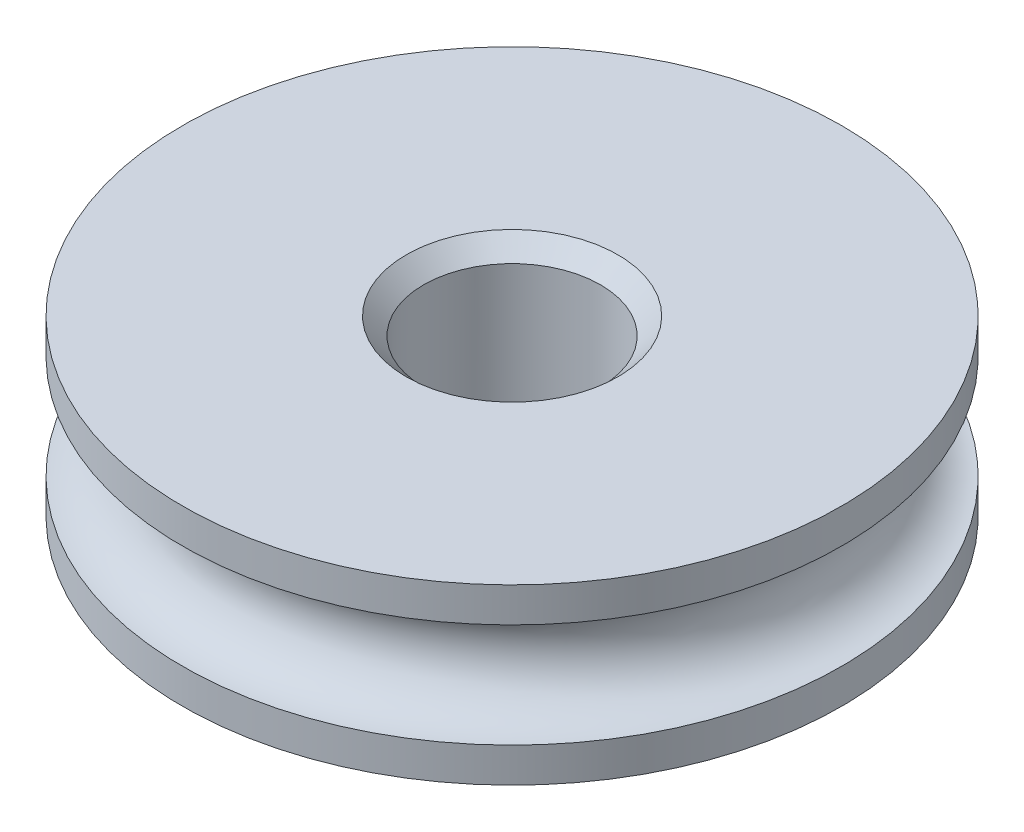
ISO-10303-21;
HEADER;
FILE_DESCRIPTION(('STEP AP214'),'2;1');
FILE_NAME('part.step','',(''),(''),'','','');
FILE_SCHEMA(('AUTOMOTIVE_DESIGN { 1 0 10303 214 1 1 1 1 }'));
ENDSEC;
DATA;
#1=APPLICATION_CONTEXT('core data for automotive mechanical design processes');
#2=APPLICATION_PROTOCOL_DEFINITION('international standard','automotive_design',2000,#1);
#3=PRODUCT_CONTEXT('',#1,'mechanical');
#4=PRODUCT('Part','Part','',(#3));
#5=PRODUCT_RELATED_PRODUCT_CATEGORY('part','',(#4));
#6=PRODUCT_DEFINITION_FORMATION('','',#4);
#7=PRODUCT_DEFINITION_CONTEXT('part definition',#1,'design');
#8=PRODUCT_DEFINITION('design','',#6,#7);
#9=PRODUCT_DEFINITION_SHAPE('','',#8);
#10=(LENGTH_UNIT() NAMED_UNIT(*) SI_UNIT(.MILLI.,.METRE.));
#11=(NAMED_UNIT(*) PLANE_ANGLE_UNIT() SI_UNIT($,.RADIAN.));
#12=(NAMED_UNIT(*) SI_UNIT($,.STERADIAN.) SOLID_ANGLE_UNIT());
#13=UNCERTAINTY_MEASURE_WITH_UNIT(LENGTH_MEASURE(1.E-05),#10,'distance_accuracy_value','');
#14=(GEOMETRIC_REPRESENTATION_CONTEXT(3) GLOBAL_UNCERTAINTY_ASSIGNED_CONTEXT((#13)) GLOBAL_UNIT_ASSIGNED_CONTEXT((#10,
#11,#12)) REPRESENTATION_CONTEXT('',''));
#15=CARTESIAN_POINT('',(0.,0.,0.));
#16=DIRECTION('',(0.,0.,1.));
#17=DIRECTION('',(1.,0.,0.));
#18=AXIS2_PLACEMENT_3D('',#15,#16,#17);
#19=CARTESIAN_POINT('',(0.,0.,0.));
#20=DIRECTION('',(0.,-1.,0.));
#21=DIRECTION('',(0.,0.,-1.));
#22=AXIS2_PLACEMENT_3D('',#19,#20,#21);
#23=PLANE('',#22);
#24=CARTESIAN_POINT('',(0.,0.,0.));
#25=DIRECTION('',(0.,-1.,0.));
#26=DIRECTION('',(0.,0.,-1.));
#27=AXIS2_PLACEMENT_3D('',#24,#25,#26);
#28=CIRCLE('',#27,7.74699999999999);
#29=CARTESIAN_POINT('',(0.,0.,-7.74699999999999));
#30=VERTEX_POINT('',#29);
#31=EDGE_CURVE('E10',#30,#30,#28,.F.);
#32=ORIENTED_EDGE('',*,*,#31,.T.);
#33=EDGE_LOOP('',(#32));
#34=FACE_BOUND('',#33,.T.);
#35=CARTESIAN_POINT('',(0.,0.,0.));
#36=DIRECTION('',(0.,-1.,0.));
#37=DIRECTION('',(0.,0.,-1.));
#38=AXIS2_PLACEMENT_3D('',#35,#36,#37);
#39=CIRCLE('',#38,24.13);
#40=CARTESIAN_POINT('',(0.,0.,-24.13));
#41=VERTEX_POINT('',#40);
#42=EDGE_CURVE('E64',#41,#41,#39,.T.);
#43=ORIENTED_EDGE('',*,*,#42,.T.);
#44=EDGE_LOOP('',(#43));
#45=FACE_BOUND('',#44,.T.);
#46=ADVANCED_FACE('F39',(#34,#45),#23,.T.);
#47=CARTESIAN_POINT('',(0.,0.,0.));
#48=DIRECTION('',(0.,-1.,0.));
#49=DIRECTION('',(0.,0.,-1.));
#50=AXIS2_PLACEMENT_3D('',#47,#48,#49);
#51=CYLINDRICAL_SURFACE('',#50,24.13);
#52=CARTESIAN_POINT('',(0.,2.54,0.));
#53=DIRECTION('',(0.,-1.,0.));
#54=DIRECTION('',(0.,0.,-1.));
#55=AXIS2_PLACEMENT_3D('',#52,#53,#54);
#56=CIRCLE('',#55,24.13);
#57=CARTESIAN_POINT('',(0.,2.54,-24.13));
#58=VERTEX_POINT('',#57);
#59=EDGE_CURVE('E68',#58,#58,#56,.T.);
#60=ORIENTED_EDGE('',*,*,#59,.T.);
#61=EDGE_LOOP('',(#60));
#62=FACE_BOUND('',#61,.T.);
#63=ORIENTED_EDGE('',*,*,#42,.F.);
#64=EDGE_LOOP('',(#63));
#65=FACE_BOUND('',#64,.T.);
#66=ADVANCED_FACE('F98',(#62,#65),#51,.T.);
#67=CARTESIAN_POINT('',(0.,6.35,0.));
#68=DIRECTION('',(0.,-1.,0.));
#69=DIRECTION('',(0.,0.,-1.));
#70=AXIS2_PLACEMENT_3D('',#67,#68,#69);
#71=TOROIDAL_SURFACE('',#70,24.13,3.81);
#72=CARTESIAN_POINT('',(0.,10.16,0.));
#73=DIRECTION('',(0.,-1.,0.));
#74=DIRECTION('',(0.,0.,-1.));
#75=AXIS2_PLACEMENT_3D('',#72,#73,#74);
#76=CIRCLE('',#75,24.13);
#77=CARTESIAN_POINT('',(0.,10.16,-24.13));
#78=VERTEX_POINT('',#77);
#79=EDGE_CURVE('E72',#78,#78,#76,.T.);
#80=ORIENTED_EDGE('',*,*,#79,.T.);
#81=EDGE_LOOP('',(#80));
#82=FACE_BOUND('',#81,.T.);
#83=ORIENTED_EDGE('',*,*,#59,.F.);
#84=EDGE_LOOP('',(#83));
#85=FACE_BOUND('',#84,.T.);
#86=ADVANCED_FACE('F95',(#82,#85),#71,.F.);
#87=CARTESIAN_POINT('',(0.,0.,0.));
#88=DIRECTION('',(0.,-1.,0.));
#89=DIRECTION('',(0.,0.,-1.));
#90=AXIS2_PLACEMENT_3D('',#87,#88,#89);
#91=CYLINDRICAL_SURFACE('',#90,24.13);
#92=CARTESIAN_POINT('',(0.,12.7,0.));
#93=DIRECTION('',(0.,-1.,0.));
#94=DIRECTION('',(0.,0.,-1.));
#95=AXIS2_PLACEMENT_3D('',#92,#93,#94);
#96=CIRCLE('',#95,24.13);
#97=CARTESIAN_POINT('',(0.,12.7,-24.13));
#98=VERTEX_POINT('',#97);
#99=EDGE_CURVE('E76',#98,#98,#96,.T.);
#100=ORIENTED_EDGE('',*,*,#99,.T.);
#101=EDGE_LOOP('',(#100));
#102=FACE_BOUND('',#101,.T.);
#103=ORIENTED_EDGE('',*,*,#79,.F.);
#104=EDGE_LOOP('',(#103));
#105=FACE_BOUND('',#104,.T.);
#106=ADVANCED_FACE('F81',(#102,#105),#91,.T.);
#107=CARTESIAN_POINT('',(0.,12.7,-24.13));
#108=DIRECTION('',(0.,1.,0.));
#109=DIRECTION('',(0.,0.,1.));
#110=AXIS2_PLACEMENT_3D('',#107,#108,#109);
#111=PLANE('',#110);
#112=CARTESIAN_POINT('',(0.,12.7,0.));
#113=DIRECTION('',(0.,1.,0.));
#114=DIRECTION('',(0.,0.,1.));
#115=AXIS2_PLACEMENT_3D('',#112,#113,#114);
#116=CIRCLE('',#115,7.74699999999998);
#117=CARTESIAN_POINT('',(0.,12.7,7.74699999999998));
#118=VERTEX_POINT('',#117);
#119=EDGE_CURVE('E58',#118,#118,#116,.F.);
#120=ORIENTED_EDGE('',*,*,#119,.T.);
#121=EDGE_LOOP('',(#120));
#122=FACE_BOUND('',#121,.T.);
#123=ORIENTED_EDGE('',*,*,#99,.F.);
#124=EDGE_LOOP('',(#123));
#125=FACE_BOUND('',#124,.T.);
#126=ADVANCED_FACE('F84',(#122,#125),#111,.T.);
#127=CARTESIAN_POINT('',(0.,12.7,0.));
#128=DIRECTION('',(0.,-1.,0.));
#129=DIRECTION('',(0.,0.,-1.));
#130=AXIS2_PLACEMENT_3D('',#127,#128,#129);
#131=CYLINDRICAL_SURFACE('',#130,6.477);
#132=CARTESIAN_POINT('',(0.,11.43,0.));
#133=DIRECTION('',(0.,1.,0.));
#134=DIRECTION('',(0.,0.,1.));
#135=AXIS2_PLACEMENT_3D('',#132,#133,#134);
#136=CIRCLE('',#135,6.477);
#137=CARTESIAN_POINT('',(0.,11.43,6.477));
#138=VERTEX_POINT('',#137);
#139=EDGE_CURVE('E48',#138,#138,#136,.T.);
#140=ORIENTED_EDGE('',*,*,#139,.T.);
#141=EDGE_LOOP('',(#140));
#142=FACE_BOUND('',#141,.T.);
#143=CARTESIAN_POINT('',(0.,1.26999999999998,0.));
#144=DIRECTION('',(0.,-1.,0.));
#145=DIRECTION('',(0.,0.,-1.));
#146=AXIS2_PLACEMENT_3D('',#143,#144,#145);
#147=CIRCLE('',#146,6.477);
#148=CARTESIAN_POINT('',(0.,1.26999999999998,-6.477));
#149=VERTEX_POINT('',#148);
#150=EDGE_CURVE('E53',#149,#149,#147,.T.);
#151=ORIENTED_EDGE('',*,*,#150,.T.);
#152=EDGE_LOOP('',(#151));
#153=FACE_BOUND('',#152,.T.);
#154=ADVANCED_FACE('F86',(#142,#153),#131,.F.);
#155=CARTESIAN_POINT('',(0.,12.7,0.));
#156=DIRECTION('',(0.,1.,0.));
#157=DIRECTION('',(0.,0.,1.));
#158=AXIS2_PLACEMENT_3D('',#155,#156,#157);
#159=CONICAL_SURFACE('',#158,7.74699999999998,0.785398163397444);
#160=ORIENTED_EDGE('',*,*,#139,.F.);
#161=EDGE_LOOP('',(#160));
#162=FACE_BOUND('',#161,.T.);
#163=ORIENTED_EDGE('',*,*,#119,.F.);
#164=EDGE_LOOP('',(#163));
#165=FACE_BOUND('',#164,.T.);
#166=ADVANCED_FACE('F93',(#162,#165),#159,.F.);
#167=CARTESIAN_POINT('',(0.,1.26999999999998,0.));
#168=DIRECTION('',(0.,-1.,0.));
#169=DIRECTION('',(0.,0.,-1.));
#170=AXIS2_PLACEMENT_3D('',#167,#168,#169);
#171=CONICAL_SURFACE('',#170,6.477,0.785398163397451);
#172=ORIENTED_EDGE('',*,*,#31,.F.);
#173=EDGE_LOOP('',(#172));
#174=FACE_BOUND('',#173,.T.);
#175=ORIENTED_EDGE('',*,*,#150,.F.);
#176=EDGE_LOOP('',(#175));
#177=FACE_BOUND('',#176,.T.);
#178=ADVANCED_FACE('F42',(#174,#177),#171,.F.);
#179=CLOSED_SHELL('',(#46,#66,#86,#106,#126,#154,#166,#178));
#180=MANIFOLD_SOLID_BREP('B2',#179);
#181=ADVANCED_BREP_SHAPE_REPRESENTATION('',(#18,#180),#14);
#182=SHAPE_DEFINITION_REPRESENTATION(#9,#181);
ENDSEC;
END-ISO-10303-21;
